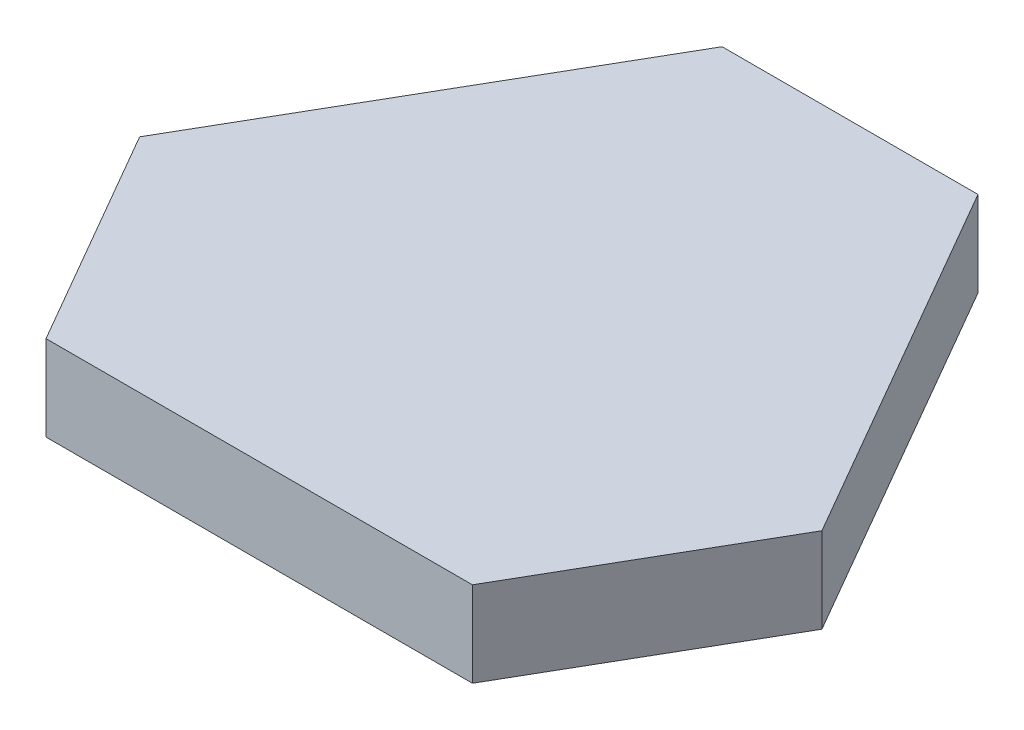
ISO-10303-21;
HEADER;
FILE_DESCRIPTION(('STEP AP214'),'2;1');
FILE_NAME('part.step','',(''),(''),'','','');
FILE_SCHEMA(('AUTOMOTIVE_DESIGN { 1 0 10303 214 1 1 1 1 }'));
ENDSEC;
DATA;
#1=APPLICATION_CONTEXT('core data for automotive mechanical design processes');
#2=APPLICATION_PROTOCOL_DEFINITION('international standard','automotive_design',2000,#1);
#3=PRODUCT_CONTEXT('',#1,'mechanical');
#4=PRODUCT('Part','Part','',(#3));
#5=PRODUCT_RELATED_PRODUCT_CATEGORY('part','',(#4));
#6=PRODUCT_DEFINITION_FORMATION('','',#4);
#7=PRODUCT_DEFINITION_CONTEXT('part definition',#1,'design');
#8=PRODUCT_DEFINITION('design','',#6,#7);
#9=PRODUCT_DEFINITION_SHAPE('','',#8);
#10=(LENGTH_UNIT() NAMED_UNIT(*) SI_UNIT(.MILLI.,.METRE.));
#11=(NAMED_UNIT(*) PLANE_ANGLE_UNIT() SI_UNIT($,.RADIAN.));
#12=(NAMED_UNIT(*) SI_UNIT($,.STERADIAN.) SOLID_ANGLE_UNIT());
#13=UNCERTAINTY_MEASURE_WITH_UNIT(LENGTH_MEASURE(1.E-05),#10,'distance_accuracy_value','');
#14=(GEOMETRIC_REPRESENTATION_CONTEXT(3) GLOBAL_UNCERTAINTY_ASSIGNED_CONTEXT((#13)) GLOBAL_UNIT_ASSIGNED_CONTEXT((#10,
#11,#12)) REPRESENTATION_CONTEXT('',''));
#15=CARTESIAN_POINT('',(0.,0.,0.));
#16=DIRECTION('',(0.,0.,1.));
#17=DIRECTION('',(1.,0.,0.));
#18=AXIS2_PLACEMENT_3D('',#15,#16,#17);
#19=CARTESIAN_POINT('',(-39.9999999999997,10.,5.77350269189622));
#20=DIRECTION('',(0.866025403784441,0.,0.499999999999996));
#21=DIRECTION('',(0.499999999999996,0.,-0.866025403784441));
#22=AXIS2_PLACEMENT_3D('',#19,#20,#21);
#23=PLANE('',#22);
#24=DIRECTION('',(-0.499999999999996,0.,0.866025403784441));
#25=VECTOR('',#24,1.);
#26=CARTESIAN_POINT('',(-39.9999999999997,0.,5.77350269189622));
#27=LINE('',#26,#25);
#28=CARTESIAN_POINT('',(-14.9999999999999,0.,-37.5277674973258));
#29=VERTEX_POINT('',#28);
#30=CARTESIAN_POINT('',(-39.9999999999997,0.,5.77350269189622));
#31=VERTEX_POINT('',#30);
#32=EDGE_CURVE('E128',#29,#31,#27,.T.);
#33=ORIENTED_EDGE('',*,*,#32,.T.);
#34=DIRECTION('',(0.,-1.,0.));
#35=VECTOR('',#34,1.);
#36=CARTESIAN_POINT('',(-39.9999999999997,10.,5.77350269189622));
#37=LINE('',#36,#35);
#38=CARTESIAN_POINT('',(-39.9999999999997,10.,5.77350269189622));
#39=VERTEX_POINT('',#38);
#40=EDGE_CURVE('E11',#39,#31,#37,.T.);
#41=ORIENTED_EDGE('',*,*,#40,.F.);
#42=DIRECTION('',(-0.499999999999996,0.,0.866025403784441));
#43=VECTOR('',#42,1.);
#44=CARTESIAN_POINT('',(-39.9999999999997,10.,5.77350269189622));
#45=LINE('',#44,#43);
#46=CARTESIAN_POINT('',(-14.9999999999999,10.,-37.5277674973258));
#47=VERTEX_POINT('',#46);
#48=EDGE_CURVE('E144',#47,#39,#45,.T.);
#49=ORIENTED_EDGE('',*,*,#48,.F.);
#50=DIRECTION('',(0.,-1.,0.));
#51=VECTOR('',#50,1.);
#52=CARTESIAN_POINT('',(-14.9999999999999,10.,-37.5277674973258));
#53=LINE('',#52,#51);
#54=EDGE_CURVE('E124',#47,#29,#53,.T.);
#55=ORIENTED_EDGE('',*,*,#54,.T.);
#56=EDGE_LOOP('',(#33,#41,#49,#55));
#57=FACE_BOUND('',#56,.T.);
#58=ADVANCED_FACE('F39',(#57),#23,.F.);
#59=CARTESIAN_POINT('',(-25.0000000000001,10.,31.7542648054296));
#60=DIRECTION('',(0.866025403784445,0.,-0.499999999999988));
#61=DIRECTION('',(-0.499999999999988,0.,-0.866025403784446));
#62=AXIS2_PLACEMENT_3D('',#59,#60,#61);
#63=PLANE('',#62);
#64=DIRECTION('',(0.499999999999988,0.,0.866025403784445));
#65=VECTOR('',#64,1.);
#66=CARTESIAN_POINT('',(-25.0000000000001,0.,31.7542648054296));
#67=LINE('',#66,#65);
#68=CARTESIAN_POINT('',(-25.0000000000001,0.,31.7542648054296));
#69=VERTEX_POINT('',#68);
#70=EDGE_CURVE('E132',#31,#69,#67,.T.);
#71=ORIENTED_EDGE('',*,*,#70,.T.);
#72=DIRECTION('',(0.,-1.,0.));
#73=VECTOR('',#72,1.);
#74=CARTESIAN_POINT('',(-25.0000000000001,10.,31.7542648054296));
#75=LINE('',#74,#73);
#76=CARTESIAN_POINT('',(-25.0000000000001,10.,31.7542648054296));
#77=VERTEX_POINT('',#76);
#78=EDGE_CURVE('E48',#77,#69,#75,.T.);
#79=ORIENTED_EDGE('',*,*,#78,.F.);
#80=DIRECTION('',(0.499999999999988,0.,0.866025403784445));
#81=VECTOR('',#80,1.);
#82=CARTESIAN_POINT('',(-25.0000000000001,10.,31.7542648054296));
#83=LINE('',#82,#81);
#84=EDGE_CURVE('E93',#39,#77,#83,.T.);
#85=ORIENTED_EDGE('',*,*,#84,.F.);
#86=ORIENTED_EDGE('',*,*,#40,.T.);
#87=EDGE_LOOP('',(#71,#79,#85,#86));
#88=FACE_BOUND('',#87,.T.);
#89=ADVANCED_FACE('F172',(#88),#63,.F.);
#90=CARTESIAN_POINT('',(24.9999999999999,10.,31.7542648054296));
#91=DIRECTION('',(0.,0.,-1.));
#92=DIRECTION('',(-1.,0.,0.));
#93=AXIS2_PLACEMENT_3D('',#90,#91,#92);
#94=PLANE('',#93);
#95=DIRECTION('',(1.,0.,0.));
#96=VECTOR('',#95,1.);
#97=CARTESIAN_POINT('',(24.9999999999999,0.,31.7542648054296));
#98=LINE('',#97,#96);
#99=CARTESIAN_POINT('',(24.9999999999999,0.,31.7542648054296));
#100=VERTEX_POINT('',#99);
#101=EDGE_CURVE('E135',#69,#100,#98,.T.);
#102=ORIENTED_EDGE('',*,*,#101,.T.);
#103=DIRECTION('',(0.,-1.,0.));
#104=VECTOR('',#103,1.);
#105=CARTESIAN_POINT('',(24.9999999999999,10.,31.7542648054296));
#106=LINE('',#105,#104);
#107=CARTESIAN_POINT('',(24.9999999999999,10.,31.7542648054296));
#108=VERTEX_POINT('',#107);
#109=EDGE_CURVE('E117',#108,#100,#106,.T.);
#110=ORIENTED_EDGE('',*,*,#109,.F.);
#111=DIRECTION('',(1.,0.,0.));
#112=VECTOR('',#111,1.);
#113=CARTESIAN_POINT('',(24.9999999999999,10.,31.7542648054296));
#114=LINE('',#113,#112);
#115=EDGE_CURVE('E106',#77,#108,#114,.T.);
#116=ORIENTED_EDGE('',*,*,#115,.F.);
#117=ORIENTED_EDGE('',*,*,#78,.T.);
#118=EDGE_LOOP('',(#102,#110,#116,#117));
#119=FACE_BOUND('',#118,.T.);
#120=ADVANCED_FACE('F154',(#119),#94,.F.);
#121=CARTESIAN_POINT('',(39.9999999999997,10.,5.77350269189632));
#122=DIRECTION('',(-0.866025403784442,0.,-0.499999999999994));
#123=DIRECTION('',(-0.499999999999994,0.,0.866025403784442));
#124=AXIS2_PLACEMENT_3D('',#121,#122,#123);
#125=PLANE('',#124);
#126=DIRECTION('',(0.499999999999994,0.,-0.866025403784442));
#127=VECTOR('',#126,1.);
#128=CARTESIAN_POINT('',(39.9999999999997,0.,5.77350269189632));
#129=LINE('',#128,#127);
#130=CARTESIAN_POINT('',(39.9999999999997,0.,5.77350269189632));
#131=VERTEX_POINT('',#130);
#132=EDGE_CURVE('E115',#100,#131,#129,.T.);
#133=ORIENTED_EDGE('',*,*,#132,.T.);
#134=DIRECTION('',(0.,-1.,0.));
#135=VECTOR('',#134,1.);
#136=CARTESIAN_POINT('',(39.9999999999997,10.,5.77350269189632));
#137=LINE('',#136,#135);
#138=CARTESIAN_POINT('',(39.9999999999997,10.,5.77350269189632));
#139=VERTEX_POINT('',#138);
#140=EDGE_CURVE('E112',#139,#131,#137,.T.);
#141=ORIENTED_EDGE('',*,*,#140,.F.);
#142=DIRECTION('',(0.499999999999994,0.,-0.866025403784442));
#143=VECTOR('',#142,1.);
#144=CARTESIAN_POINT('',(39.9999999999997,10.,5.77350269189632));
#145=LINE('',#144,#143);
#146=EDGE_CURVE('E100',#108,#139,#145,.T.);
#147=ORIENTED_EDGE('',*,*,#146,.F.);
#148=ORIENTED_EDGE('',*,*,#109,.T.);
#149=EDGE_LOOP('',(#133,#141,#147,#148));
#150=FACE_BOUND('',#149,.T.);
#151=ADVANCED_FACE('F113',(#150),#125,.F.);
#152=CARTESIAN_POINT('',(15.0000000000001,10.,-37.5277674973258));
#153=DIRECTION('',(-0.866025403784442,0.,0.499999999999993));
#154=DIRECTION('',(0.499999999999993,0.,0.866025403784442));
#155=AXIS2_PLACEMENT_3D('',#152,#153,#154);
#156=PLANE('',#155);
#157=DIRECTION('',(-0.499999999999993,0.,-0.866025403784443));
#158=VECTOR('',#157,1.);
#159=CARTESIAN_POINT('',(15.0000000000001,0.,-37.5277674973258));
#160=LINE('',#159,#158);
#161=CARTESIAN_POINT('',(15.0000000000001,0.,-37.5277674973258));
#162=VERTEX_POINT('',#161);
#163=EDGE_CURVE('E79',#131,#162,#160,.T.);
#164=ORIENTED_EDGE('',*,*,#163,.T.);
#165=DIRECTION('',(0.,-1.,0.));
#166=VECTOR('',#165,1.);
#167=CARTESIAN_POINT('',(15.0000000000001,10.,-37.5277674973258));
#168=LINE('',#167,#166);
#169=CARTESIAN_POINT('',(15.0000000000001,10.,-37.5277674973258));
#170=VERTEX_POINT('',#169);
#171=EDGE_CURVE('E118',#170,#162,#168,.T.);
#172=ORIENTED_EDGE('',*,*,#171,.F.);
#173=DIRECTION('',(-0.499999999999993,0.,-0.866025403784443));
#174=VECTOR('',#173,1.);
#175=CARTESIAN_POINT('',(15.0000000000001,10.,-37.5277674973258));
#176=LINE('',#175,#174);
#177=EDGE_CURVE('E104',#139,#170,#176,.T.);
#178=ORIENTED_EDGE('',*,*,#177,.F.);
#179=ORIENTED_EDGE('',*,*,#140,.T.);
#180=EDGE_LOOP('',(#164,#172,#178,#179));
#181=FACE_BOUND('',#180,.T.);
#182=ADVANCED_FACE('F120',(#181),#156,.F.);
#183=CARTESIAN_POINT('',(-14.9999999999999,10.,-37.5277674973258));
#184=DIRECTION('',(0.,0.,1.));
#185=DIRECTION('',(1.,0.,0.));
#186=AXIS2_PLACEMENT_3D('',#183,#184,#185);
#187=PLANE('',#186);
#188=DIRECTION('',(-1.,0.,0.));
#189=VECTOR('',#188,1.);
#190=CARTESIAN_POINT('',(-14.9999999999999,0.,-37.5277674973258));
#191=LINE('',#190,#189);
#192=EDGE_CURVE('E85',#162,#29,#191,.T.);
#193=ORIENTED_EDGE('',*,*,#192,.T.);
#194=ORIENTED_EDGE('',*,*,#54,.F.);
#195=DIRECTION('',(-1.,0.,0.));
#196=VECTOR('',#195,1.);
#197=CARTESIAN_POINT('',(-14.9999999999999,10.,-37.5277674973258));
#198=LINE('',#197,#196);
#199=EDGE_CURVE('E56',#170,#47,#198,.T.);
#200=ORIENTED_EDGE('',*,*,#199,.F.);
#201=ORIENTED_EDGE('',*,*,#171,.T.);
#202=EDGE_LOOP('',(#193,#194,#200,#201));
#203=FACE_BOUND('',#202,.T.);
#204=ADVANCED_FACE('F161',(#203),#187,.F.);
#205=CARTESIAN_POINT('',(0.,10.,0.));
#206=DIRECTION('',(0.,-1.,0.));
#207=DIRECTION('',(0.,0.,-1.));
#208=AXIS2_PLACEMENT_3D('',#205,#206,#207);
#209=PLANE('',#208);
#210=ORIENTED_EDGE('',*,*,#48,.T.);
#211=ORIENTED_EDGE('',*,*,#84,.T.);
#212=ORIENTED_EDGE('',*,*,#115,.T.);
#213=ORIENTED_EDGE('',*,*,#146,.T.);
#214=ORIENTED_EDGE('',*,*,#177,.T.);
#215=ORIENTED_EDGE('',*,*,#199,.T.);
#216=EDGE_LOOP('',(#210,#211,#212,#213,#214,#215));
#217=FACE_BOUND('',#216,.T.);
#218=ADVANCED_FACE('F102',(#217),#209,.F.);
#219=CARTESIAN_POINT('',(0.,0.,0.));
#220=DIRECTION('',(0.,-1.,0.));
#221=DIRECTION('',(0.,0.,-1.));
#222=AXIS2_PLACEMENT_3D('',#219,#220,#221);
#223=PLANE('',#222);
#224=ORIENTED_EDGE('',*,*,#32,.F.);
#225=ORIENTED_EDGE('',*,*,#192,.F.);
#226=ORIENTED_EDGE('',*,*,#163,.F.);
#227=ORIENTED_EDGE('',*,*,#132,.F.);
#228=ORIENTED_EDGE('',*,*,#101,.F.);
#229=ORIENTED_EDGE('',*,*,#70,.F.);
#230=EDGE_LOOP('',(#224,#225,#226,#227,#228,#229));
#231=FACE_BOUND('',#230,.T.);
#232=ADVANCED_FACE('F157',(#231),#223,.T.);
#233=CLOSED_SHELL('',(#58,#89,#120,#151,#182,#204,#218,#232));
#234=MANIFOLD_SOLID_BREP('B2',#233);
#235=ADVANCED_BREP_SHAPE_REPRESENTATION('',(#18,#234),#14);
#236=SHAPE_DEFINITION_REPRESENTATION(#9,#235);
ENDSEC;
END-ISO-10303-21;
